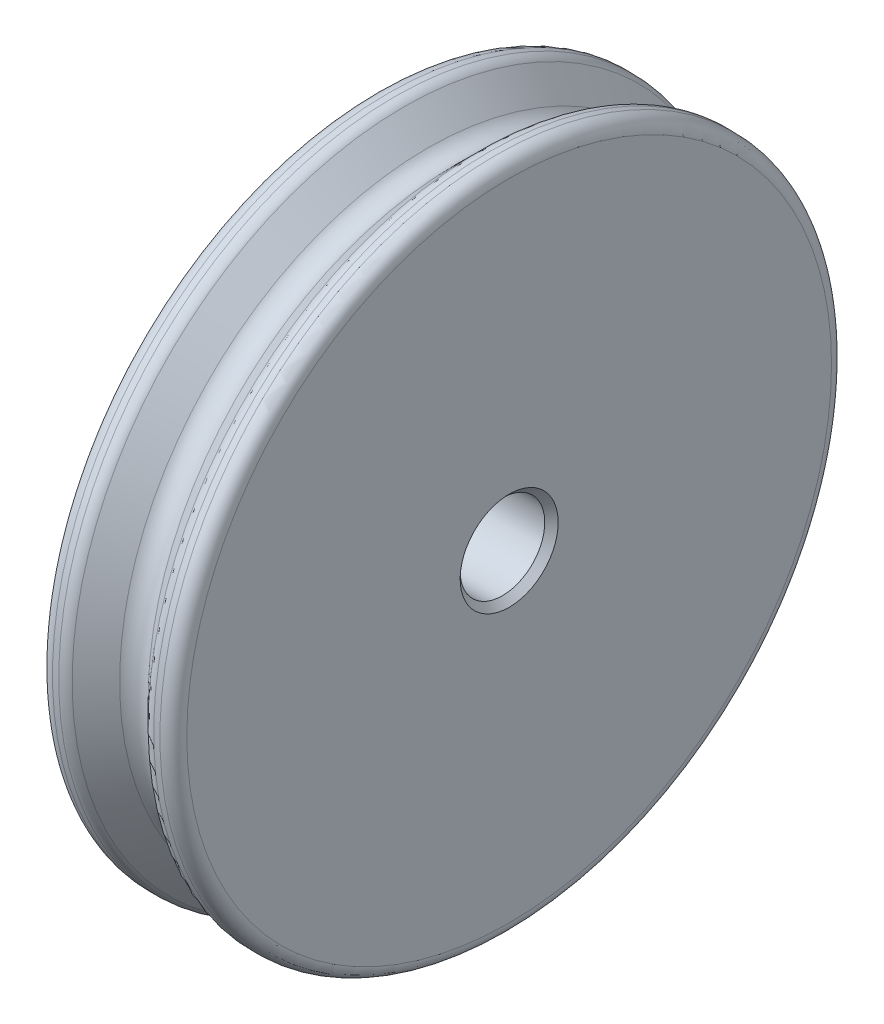
ISO-10303-21;
HEADER;
FILE_DESCRIPTION(('STEP AP214'),'2;1');
FILE_NAME('part.step','',(''),(''),'','','');
FILE_SCHEMA(('AUTOMOTIVE_DESIGN { 1 0 10303 214 1 1 1 1 }'));
ENDSEC;
DATA;
#1=APPLICATION_CONTEXT('core data for automotive mechanical design processes');
#2=APPLICATION_PROTOCOL_DEFINITION('international standard','automotive_design',2000,#1);
#3=PRODUCT_CONTEXT('',#1,'mechanical');
#4=PRODUCT('Part','Part','',(#3));
#5=PRODUCT_RELATED_PRODUCT_CATEGORY('part','',(#4));
#6=PRODUCT_DEFINITION_FORMATION('','',#4);
#7=PRODUCT_DEFINITION_CONTEXT('part definition',#1,'design');
#8=PRODUCT_DEFINITION('design','',#6,#7);
#9=PRODUCT_DEFINITION_SHAPE('','',#8);
#10=(LENGTH_UNIT() NAMED_UNIT(*) SI_UNIT(.MILLI.,.METRE.));
#11=(NAMED_UNIT(*) PLANE_ANGLE_UNIT() SI_UNIT($,.RADIAN.));
#12=(NAMED_UNIT(*) SI_UNIT($,.STERADIAN.) SOLID_ANGLE_UNIT());
#13=UNCERTAINTY_MEASURE_WITH_UNIT(LENGTH_MEASURE(1.E-05),#10,'distance_accuracy_value','');
#14=(GEOMETRIC_REPRESENTATION_CONTEXT(3) GLOBAL_UNCERTAINTY_ASSIGNED_CONTEXT((#13)) GLOBAL_UNIT_ASSIGNED_CONTEXT((#10,
#11,#12)) REPRESENTATION_CONTEXT('',''));
#15=CARTESIAN_POINT('',(0.,0.,0.));
#16=DIRECTION('',(0.,0.,1.));
#17=DIRECTION('',(1.,0.,0.));
#18=AXIS2_PLACEMENT_3D('',#15,#16,#17);
#19=CARTESIAN_POINT('',(3.12132034355962,0.,0.));
#20=DIRECTION('',(1.,0.,0.));
#21=DIRECTION('',(0.,1.,0.));
#22=AXIS2_PLACEMENT_3D('',#19,#20,#21);
#23=CONICAL_SURFACE('',#22,25.,0.785398163397448);
#24=CARTESIAN_POINT('',(2.82842712474617,0.,0.));
#25=DIRECTION('',(-1.,0.,0.));
#26=DIRECTION('',(0.,-1.,0.));
#27=AXIS2_PLACEMENT_3D('',#24,#25,#26);
#28=CIRCLE('',#27,24.7071067811865);
#29=CARTESIAN_POINT('',(2.82842712474617,-24.7071067811865,0.));
#30=VERTEX_POINT('',#29);
#31=EDGE_CURVE('E47',#30,#30,#28,.T.);
#32=ORIENTED_EDGE('',*,*,#31,.T.);
#33=EDGE_LOOP('',(#32));
#34=FACE_BOUND('',#33,.T.);
#35=CARTESIAN_POINT('',(1.06066017177982,0.,0.));
#36=DIRECTION('',(-1.,0.,0.));
#37=DIRECTION('',(0.,-1.,0.));
#38=AXIS2_PLACEMENT_3D('',#35,#36,#37);
#39=CIRCLE('',#38,22.9393398282202);
#40=CARTESIAN_POINT('',(1.06066017177982,-22.9393398282202,0.));
#41=VERTEX_POINT('',#40);
#42=EDGE_CURVE('E84',#41,#41,#39,.T.);
#43=ORIENTED_EDGE('',*,*,#42,.F.);
#44=EDGE_LOOP('',(#43));
#45=FACE_BOUND('',#44,.T.);
#46=ADVANCED_FACE('F40',(#34,#45),#23,.T.);
#47=CARTESIAN_POINT('',(0.,0.,0.));
#48=DIRECTION('',(-1.,0.,0.));
#49=DIRECTION('',(0.,-1.,0.));
#50=AXIS2_PLACEMENT_3D('',#47,#48,#49);
#51=TOROIDAL_SURFACE('',#50,24.,1.5);
#52=CARTESIAN_POINT('',(-1.06066017177982,0.,0.));
#53=DIRECTION('',(-1.,0.,0.));
#54=DIRECTION('',(0.,-1.,0.));
#55=AXIS2_PLACEMENT_3D('',#52,#53,#54);
#56=CIRCLE('',#55,22.9393398282202);
#57=CARTESIAN_POINT('',(-1.06066017177981,-22.9393398282202,0.));
#58=VERTEX_POINT('',#57);
#59=EDGE_CURVE('E87',#58,#58,#56,.T.);
#60=ORIENTED_EDGE('',*,*,#59,.F.);
#61=EDGE_LOOP('',(#60));
#62=FACE_BOUND('',#61,.T.);
#63=ORIENTED_EDGE('',*,*,#42,.T.);
#64=EDGE_LOOP('',(#63));
#65=FACE_BOUND('',#64,.T.);
#66=ADVANCED_FACE('F93',(#62,#65),#51,.F.);
#67=CARTESIAN_POINT('',(-1.06066017177982,0.,0.));
#68=DIRECTION('',(-1.,0.,0.));
#69=DIRECTION('',(0.,-1.,0.));
#70=AXIS2_PLACEMENT_3D('',#67,#68,#69);
#71=CONICAL_SURFACE('',#70,22.9393398282202,0.785398163397448);
#72=CARTESIAN_POINT('',(-2.82842712474617,0.,0.));
#73=DIRECTION('',(1.,0.,0.));
#74=DIRECTION('',(0.,1.,0.));
#75=AXIS2_PLACEMENT_3D('',#72,#73,#74);
#76=CIRCLE('',#75,24.7071067811865);
#77=CARTESIAN_POINT('',(-2.82842712474617,24.7071067811865,0.));
#78=VERTEX_POINT('',#77);
#79=EDGE_CURVE('E10',#78,#78,#76,.T.);
#80=ORIENTED_EDGE('',*,*,#79,.T.);
#81=EDGE_LOOP('',(#80));
#82=FACE_BOUND('',#81,.T.);
#83=ORIENTED_EDGE('',*,*,#59,.T.);
#84=EDGE_LOOP('',(#83));
#85=FACE_BOUND('',#84,.T.);
#86=ADVANCED_FACE('F91',(#82,#85),#71,.T.);
#87=CARTESIAN_POINT('',(-80.8384676175642,0.,0.));
#88=DIRECTION('',(-1.,0.,0.));
#89=DIRECTION('',(0.,-1.,0.));
#90=AXIS2_PLACEMENT_3D('',#87,#88,#89);
#91=CYLINDRICAL_SURFACE('',#90,25.);
#92=CARTESIAN_POINT('',(-4.,0.,0.));
#93=DIRECTION('',(1.,0.,0.));
#94=DIRECTION('',(0.,1.,0.));
#95=AXIS2_PLACEMENT_3D('',#92,#93,#94);
#96=CIRCLE('',#95,25.);
#97=CARTESIAN_POINT('',(-4.00000000000001,25.,0.));
#98=VERTEX_POINT('',#97);
#99=EDGE_CURVE('E51',#98,#98,#96,.T.);
#100=ORIENTED_EDGE('',*,*,#99,.T.);
#101=EDGE_LOOP('',(#100));
#102=FACE_BOUND('',#101,.T.);
#103=CARTESIAN_POINT('',(-3.53553390593271,0.,0.));
#104=DIRECTION('',(1.,0.,0.));
#105=DIRECTION('',(0.,1.,0.));
#106=AXIS2_PLACEMENT_3D('',#103,#104,#105);
#107=CIRCLE('',#106,25.);
#108=CARTESIAN_POINT('',(-3.53553390593271,25.,0.));
#109=VERTEX_POINT('',#108);
#110=EDGE_CURVE('E55',#109,#109,#107,.F.);
#111=ORIENTED_EDGE('',*,*,#110,.T.);
#112=EDGE_LOOP('',(#111));
#113=FACE_BOUND('',#112,.T.);
#114=ADVANCED_FACE('F154',(#102,#113),#91,.T.);
#115=CARTESIAN_POINT('',(-5.00000000000001,3.14999999999999,0.));
#116=DIRECTION('',(1.,0.,0.));
#117=DIRECTION('',(0.,1.,0.));
#118=AXIS2_PLACEMENT_3D('',#115,#116,#117);
#119=PLANE('',#118);
#120=CARTESIAN_POINT('',(-5.00000000000001,0.,0.));
#121=DIRECTION('',(1.,0.,0.));
#122=DIRECTION('',(0.,1.,0.));
#123=AXIS2_PLACEMENT_3D('',#120,#121,#122);
#124=CIRCLE('',#123,24.);
#125=CARTESIAN_POINT('',(-5.00000000000001,24.,0.));
#126=VERTEX_POINT('',#125);
#127=EDGE_CURVE('E60',#126,#126,#124,.F.);
#128=ORIENTED_EDGE('',*,*,#127,.T.);
#129=EDGE_LOOP('',(#128));
#130=FACE_BOUND('',#129,.T.);
#131=CARTESIAN_POINT('',(-5.00000000000001,0.,0.));
#132=DIRECTION('',(1.,0.,0.));
#133=DIRECTION('',(0.,1.,0.));
#134=AXIS2_PLACEMENT_3D('',#131,#132,#133);
#135=CIRCLE('',#134,3.65);
#136=CARTESIAN_POINT('',(-5.00000000000001,3.65000000000001,0.));
#137=VERTEX_POINT('',#136);
#138=EDGE_CURVE('E75',#137,#137,#135,.T.);
#139=ORIENTED_EDGE('',*,*,#138,.T.);
#140=EDGE_LOOP('',(#139));
#141=FACE_BOUND('',#140,.T.);
#142=ADVANCED_FACE('F150',(#130,#141),#119,.F.);
#143=CARTESIAN_POINT('',(-80.8384676175642,0.,0.));
#144=DIRECTION('',(-1.,0.,0.));
#145=DIRECTION('',(0.,-1.,0.));
#146=AXIS2_PLACEMENT_3D('',#143,#144,#145);
#147=CYLINDRICAL_SURFACE('',#146,3.14999999999998);
#148=CARTESIAN_POINT('',(-4.49999999999999,0.,0.));
#149=DIRECTION('',(1.,0.,0.));
#150=DIRECTION('',(0.,1.,0.));
#151=AXIS2_PLACEMENT_3D('',#148,#149,#150);
#152=CIRCLE('',#151,3.14999999999998);
#153=CARTESIAN_POINT('',(-4.49999999999999,3.14999999999999,0.));
#154=VERTEX_POINT('',#153);
#155=EDGE_CURVE('E78',#154,#154,#152,.F.);
#156=ORIENTED_EDGE('',*,*,#155,.T.);
#157=EDGE_LOOP('',(#156));
#158=FACE_BOUND('',#157,.T.);
#159=CARTESIAN_POINT('',(4.5,0.,0.));
#160=DIRECTION('',(-1.,0.,0.));
#161=DIRECTION('',(0.,-1.,0.));
#162=AXIS2_PLACEMENT_3D('',#159,#160,#161);
#163=CIRCLE('',#162,3.14999999999998);
#164=CARTESIAN_POINT('',(4.5,-3.14999999999997,0.));
#165=VERTEX_POINT('',#164);
#166=EDGE_CURVE('E81',#165,#165,#163,.F.);
#167=ORIENTED_EDGE('',*,*,#166,.T.);
#168=EDGE_LOOP('',(#167));
#169=FACE_BOUND('',#168,.T.);
#170=ADVANCED_FACE('F144',(#158,#169),#147,.F.);
#171=CARTESIAN_POINT('',(4.99999999999999,3.14999999999999,0.));
#172=DIRECTION('',(-1.,0.,0.));
#173=DIRECTION('',(0.,-1.,0.));
#174=AXIS2_PLACEMENT_3D('',#171,#172,#173);
#175=PLANE('',#174);
#176=CARTESIAN_POINT('',(4.99999999999999,0.,0.));
#177=DIRECTION('',(-1.,0.,0.));
#178=DIRECTION('',(0.,-1.,0.));
#179=AXIS2_PLACEMENT_3D('',#176,#177,#178);
#180=CIRCLE('',#179,24.);
#181=CARTESIAN_POINT('',(4.99999999999999,-24.,0.));
#182=VERTEX_POINT('',#181);
#183=EDGE_CURVE('E63',#182,#182,#180,.F.);
#184=ORIENTED_EDGE('',*,*,#183,.T.);
#185=EDGE_LOOP('',(#184));
#186=FACE_BOUND('',#185,.T.);
#187=CARTESIAN_POINT('',(4.99999999999999,0.,0.));
#188=DIRECTION('',(-1.,0.,0.));
#189=DIRECTION('',(0.,-1.,0.));
#190=AXIS2_PLACEMENT_3D('',#187,#188,#189);
#191=CIRCLE('',#190,3.64999999999997);
#192=CARTESIAN_POINT('',(4.99999999999999,-3.64999999999996,0.));
#193=VERTEX_POINT('',#192);
#194=EDGE_CURVE('E72',#193,#193,#191,.T.);
#195=ORIENTED_EDGE('',*,*,#194,.T.);
#196=EDGE_LOOP('',(#195));
#197=FACE_BOUND('',#196,.T.);
#198=ADVANCED_FACE('F138',(#186,#197),#175,.F.);
#199=CARTESIAN_POINT('',(-80.8384676175642,0.,0.));
#200=DIRECTION('',(-1.,0.,0.));
#201=DIRECTION('',(0.,-1.,0.));
#202=AXIS2_PLACEMENT_3D('',#199,#200,#201);
#203=CYLINDRICAL_SURFACE('',#202,25.);
#204=CARTESIAN_POINT('',(3.99999999999999,0.,0.));
#205=DIRECTION('',(-1.,0.,0.));
#206=DIRECTION('',(0.,-1.,0.));
#207=AXIS2_PLACEMENT_3D('',#204,#205,#206);
#208=CIRCLE('',#207,25.);
#209=CARTESIAN_POINT('',(3.99999999999999,-25.,0.));
#210=VERTEX_POINT('',#209);
#211=EDGE_CURVE('E66',#210,#210,#208,.T.);
#212=ORIENTED_EDGE('',*,*,#211,.T.);
#213=EDGE_LOOP('',(#212));
#214=FACE_BOUND('',#213,.T.);
#215=CARTESIAN_POINT('',(3.53553390593271,0.,0.));
#216=DIRECTION('',(1.,0.,0.));
#217=DIRECTION('',(0.,1.,0.));
#218=AXIS2_PLACEMENT_3D('',#215,#216,#217);
#219=CIRCLE('',#218,25.);
#220=CARTESIAN_POINT('',(3.53553390593271,25.,0.));
#221=VERTEX_POINT('',#220);
#222=EDGE_CURVE('E69',#221,#221,#219,.T.);
#223=ORIENTED_EDGE('',*,*,#222,.T.);
#224=EDGE_LOOP('',(#223));
#225=FACE_BOUND('',#224,.T.);
#226=ADVANCED_FACE('F113',(#214,#225),#203,.T.);
#227=CARTESIAN_POINT('',(-4.49999999999999,0.,0.));
#228=DIRECTION('',(-1.,0.,0.));
#229=DIRECTION('',(0.,-1.,0.));
#230=AXIS2_PLACEMENT_3D('',#227,#228,#229);
#231=CONICAL_SURFACE('',#230,3.14999999999998,0.785398163397446);
#232=ORIENTED_EDGE('',*,*,#138,.F.);
#233=EDGE_LOOP('',(#232));
#234=FACE_BOUND('',#233,.T.);
#235=ORIENTED_EDGE('',*,*,#155,.F.);
#236=EDGE_LOOP('',(#235));
#237=FACE_BOUND('',#236,.T.);
#238=ADVANCED_FACE('F106',(#234,#237),#231,.F.);
#239=CARTESIAN_POINT('',(4.99999999999999,0.,0.));
#240=DIRECTION('',(1.,0.,0.));
#241=DIRECTION('',(0.,1.,0.));
#242=AXIS2_PLACEMENT_3D('',#239,#240,#241);
#243=CONICAL_SURFACE('',#242,3.64999999999997,0.785398163397453);
#244=ORIENTED_EDGE('',*,*,#166,.F.);
#245=EDGE_LOOP('',(#244));
#246=FACE_BOUND('',#245,.T.);
#247=ORIENTED_EDGE('',*,*,#194,.F.);
#248=EDGE_LOOP('',(#247));
#249=FACE_BOUND('',#248,.T.);
#250=ADVANCED_FACE('F112',(#246,#249),#243,.F.);
#251=CARTESIAN_POINT('',(3.99999999999999,0.,0.));
#252=DIRECTION('',(-1.,0.,0.));
#253=DIRECTION('',(0.,-1.,0.));
#254=AXIS2_PLACEMENT_3D('',#251,#252,#253);
#255=TOROIDAL_SURFACE('',#254,24.,1.);
#256=ORIENTED_EDGE('',*,*,#183,.F.);
#257=EDGE_LOOP('',(#256));
#258=FACE_BOUND('',#257,.T.);
#259=ORIENTED_EDGE('',*,*,#211,.F.);
#260=EDGE_LOOP('',(#259));
#261=FACE_BOUND('',#260,.T.);
#262=ADVANCED_FACE('F119',(#258,#261),#255,.T.);
#263=CARTESIAN_POINT('',(-4.,0.,0.));
#264=DIRECTION('',(1.,0.,0.));
#265=DIRECTION('',(0.,1.,0.));
#266=AXIS2_PLACEMENT_3D('',#263,#264,#265);
#267=TOROIDAL_SURFACE('',#266,24.,1.);
#268=ORIENTED_EDGE('',*,*,#99,.F.);
#269=EDGE_LOOP('',(#268));
#270=FACE_BOUND('',#269,.T.);
#271=ORIENTED_EDGE('',*,*,#127,.F.);
#272=EDGE_LOOP('',(#271));
#273=FACE_BOUND('',#272,.T.);
#274=ADVANCED_FACE('F123',(#270,#273),#267,.T.);
#275=CARTESIAN_POINT('',(3.53553390593271,0.,0.));
#276=DIRECTION('',(1.,0.,0.));
#277=DIRECTION('',(0.,1.,0.));
#278=AXIS2_PLACEMENT_3D('',#275,#276,#277);
#279=TOROIDAL_SURFACE('',#278,24.,1.);
#280=ORIENTED_EDGE('',*,*,#222,.F.);
#281=EDGE_LOOP('',(#280));
#282=FACE_BOUND('',#281,.T.);
#283=ORIENTED_EDGE('',*,*,#31,.F.);
#284=EDGE_LOOP('',(#283));
#285=FACE_BOUND('',#284,.T.);
#286=ADVANCED_FACE('F126',(#282,#285),#279,.T.);
#287=CARTESIAN_POINT('',(-3.53553390593272,0.,0.));
#288=DIRECTION('',(1.,0.,0.));
#289=DIRECTION('',(0.,1.,0.));
#290=AXIS2_PLACEMENT_3D('',#287,#288,#289);
#291=TOROIDAL_SURFACE('',#290,24.,1.);
#292=ORIENTED_EDGE('',*,*,#79,.F.);
#293=EDGE_LOOP('',(#292));
#294=FACE_BOUND('',#293,.T.);
#295=ORIENTED_EDGE('',*,*,#110,.F.);
#296=EDGE_LOOP('',(#295));
#297=FACE_BOUND('',#296,.T.);
#298=ADVANCED_FACE('F42',(#294,#297),#291,.T.);
#299=CLOSED_SHELL('',(#46,#66,#86,#114,#142,#170,#198,#226,#238,#250,#262,#274,#286,#298));
#300=MANIFOLD_SOLID_BREP('B2',#299);
#301=ADVANCED_BREP_SHAPE_REPRESENTATION('',(#18,#300),#14);
#302=SHAPE_DEFINITION_REPRESENTATION(#9,#301);
ENDSEC;
END-ISO-10303-21;
